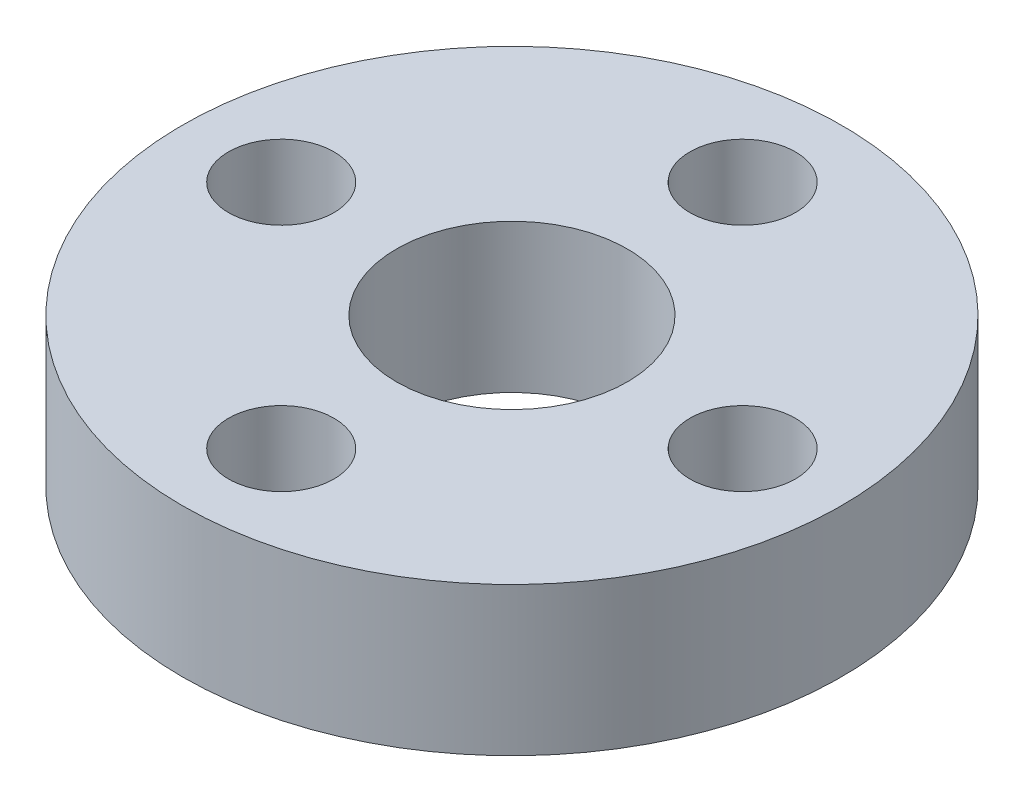
ISO-10303-21;
HEADER;
FILE_DESCRIPTION(('STEP AP214'),'2;1');
FILE_NAME('part.step','',(''),(''),'','','');
FILE_SCHEMA(('AUTOMOTIVE_DESIGN { 1 0 10303 214 1 1 1 1 }'));
ENDSEC;
DATA;
#1=APPLICATION_CONTEXT('core data for automotive mechanical design processes');
#2=APPLICATION_PROTOCOL_DEFINITION('international standard','automotive_design',2000,#1);
#3=PRODUCT_CONTEXT('',#1,'mechanical');
#4=PRODUCT('Part','Part','',(#3));
#5=PRODUCT_RELATED_PRODUCT_CATEGORY('part','',(#4));
#6=PRODUCT_DEFINITION_FORMATION('','',#4);
#7=PRODUCT_DEFINITION_CONTEXT('part definition',#1,'design');
#8=PRODUCT_DEFINITION('design','',#6,#7);
#9=PRODUCT_DEFINITION_SHAPE('','',#8);
#10=(LENGTH_UNIT() NAMED_UNIT(*) SI_UNIT(.MILLI.,.METRE.));
#11=(NAMED_UNIT(*) PLANE_ANGLE_UNIT() SI_UNIT($,.RADIAN.));
#12=(NAMED_UNIT(*) SI_UNIT($,.STERADIAN.) SOLID_ANGLE_UNIT());
#13=UNCERTAINTY_MEASURE_WITH_UNIT(LENGTH_MEASURE(1.E-05),#10,'distance_accuracy_value','');
#14=(GEOMETRIC_REPRESENTATION_CONTEXT(3) GLOBAL_UNCERTAINTY_ASSIGNED_CONTEXT((#13)) GLOBAL_UNIT_ASSIGNED_CONTEXT((#10,
#11,#12)) REPRESENTATION_CONTEXT('',''));
#15=CARTESIAN_POINT('',(0.,0.,0.));
#16=DIRECTION('',(0.,0.,1.));
#17=DIRECTION('',(1.,0.,0.));
#18=AXIS2_PLACEMENT_3D('',#15,#16,#17);
#19=CARTESIAN_POINT('',(0.,4.5,0.));
#20=DIRECTION('',(0.,1.,0.));
#21=DIRECTION('',(0.,0.,1.));
#22=AXIS2_PLACEMENT_3D('',#19,#20,#21);
#23=PLANE('',#22);
#24=CARTESIAN_POINT('',(0.,4.5,7.));
#25=DIRECTION('',(0.,1.,0.));
#26=DIRECTION('',(0.,0.,-1.));
#27=AXIS2_PLACEMENT_3D('',#24,#25,#26);
#28=CIRCLE('',#27,1.6);
#29=CARTESIAN_POINT('',(0.,4.5,5.4));
#30=VERTEX_POINT('',#29);
#31=EDGE_CURVE('E76',#30,#30,#28,.T.);
#32=ORIENTED_EDGE('',*,*,#31,.F.);
#33=EDGE_LOOP('',(#32));
#34=FACE_BOUND('',#33,.T.);
#35=CARTESIAN_POINT('',(7.,4.5,0.));
#36=DIRECTION('',(0.,1.,0.));
#37=DIRECTION('',(0.,0.,1.));
#38=AXIS2_PLACEMENT_3D('',#35,#36,#37);
#39=CIRCLE('',#38,1.6);
#40=CARTESIAN_POINT('',(7.,4.5,1.6));
#41=VERTEX_POINT('',#40);
#42=EDGE_CURVE('E60',#41,#41,#39,.T.);
#43=ORIENTED_EDGE('',*,*,#42,.F.);
#44=EDGE_LOOP('',(#43));
#45=FACE_BOUND('',#44,.T.);
#46=CARTESIAN_POINT('',(0.,4.5,0.));
#47=DIRECTION('',(0.,1.,0.));
#48=DIRECTION('',(0.,0.,1.));
#49=AXIS2_PLACEMENT_3D('',#46,#47,#48);
#50=CIRCLE('',#49,10.);
#51=CARTESIAN_POINT('',(0.,4.5,10.));
#52=VERTEX_POINT('',#51);
#53=EDGE_CURVE('E10',#52,#52,#50,.T.);
#54=ORIENTED_EDGE('',*,*,#53,.T.);
#55=EDGE_LOOP('',(#54));
#56=FACE_BOUND('',#55,.T.);
#57=CARTESIAN_POINT('',(0.,4.5,-7.));
#58=DIRECTION('',(0.,1.,0.));
#59=DIRECTION('',(0.,0.,1.));
#60=AXIS2_PLACEMENT_3D('',#57,#58,#59);
#61=CIRCLE('',#60,1.6);
#62=CARTESIAN_POINT('',(0.,4.5,-5.4));
#63=VERTEX_POINT('',#62);
#64=EDGE_CURVE('E54',#63,#63,#61,.T.);
#65=ORIENTED_EDGE('',*,*,#64,.F.);
#66=EDGE_LOOP('',(#65));
#67=FACE_BOUND('',#66,.T.);
#68=CARTESIAN_POINT('',(0.,4.5,0.));
#69=DIRECTION('',(0.,1.,0.));
#70=DIRECTION('',(0.,0.,1.));
#71=AXIS2_PLACEMENT_3D('',#68,#69,#70);
#72=CIRCLE('',#71,3.5);
#73=CARTESIAN_POINT('',(0.,4.5,3.5));
#74=VERTEX_POINT('',#73);
#75=EDGE_CURVE('E68',#74,#74,#72,.T.);
#76=ORIENTED_EDGE('',*,*,#75,.F.);
#77=EDGE_LOOP('',(#76));
#78=FACE_BOUND('',#77,.T.);
#79=CARTESIAN_POINT('',(-7.,4.5,0.));
#80=DIRECTION('',(0.,1.,0.));
#81=DIRECTION('',(0.,0.,-1.));
#82=AXIS2_PLACEMENT_3D('',#79,#80,#81);
#83=CIRCLE('',#82,1.6);
#84=CARTESIAN_POINT('',(-7.,4.5,-1.6));
#85=VERTEX_POINT('',#84);
#86=EDGE_CURVE('E84',#85,#85,#83,.T.);
#87=ORIENTED_EDGE('',*,*,#86,.F.);
#88=EDGE_LOOP('',(#87));
#89=FACE_BOUND('',#88,.T.);
#90=ADVANCED_FACE('F41',(#34,#45,#56,#67,#78,#89),#23,.T.);
#91=CARTESIAN_POINT('',(0.,0.,0.));
#92=DIRECTION('',(0.,1.,0.));
#93=DIRECTION('',(0.,0.,1.));
#94=AXIS2_PLACEMENT_3D('',#91,#92,#93);
#95=PLANE('',#94);
#96=CARTESIAN_POINT('',(0.,0.,0.));
#97=DIRECTION('',(0.,1.,0.));
#98=DIRECTION('',(0.,0.,1.));
#99=AXIS2_PLACEMENT_3D('',#96,#97,#98);
#100=CIRCLE('',#99,10.);
#101=CARTESIAN_POINT('',(0.,0.,10.));
#102=VERTEX_POINT('',#101);
#103=EDGE_CURVE('E45',#102,#102,#100,.T.);
#104=ORIENTED_EDGE('',*,*,#103,.F.);
#105=EDGE_LOOP('',(#104));
#106=FACE_BOUND('',#105,.T.);
#107=CARTESIAN_POINT('',(0.,0.,-7.));
#108=DIRECTION('',(0.,1.,0.));
#109=DIRECTION('',(0.,0.,1.));
#110=AXIS2_PLACEMENT_3D('',#107,#108,#109);
#111=CIRCLE('',#110,1.6);
#112=CARTESIAN_POINT('',(0.,0.,-5.4));
#113=VERTEX_POINT('',#112);
#114=EDGE_CURVE('E56',#113,#113,#111,.T.);
#115=ORIENTED_EDGE('',*,*,#114,.T.);
#116=EDGE_LOOP('',(#115));
#117=FACE_BOUND('',#116,.T.);
#118=CARTESIAN_POINT('',(7.,0.,0.));
#119=DIRECTION('',(0.,1.,0.));
#120=DIRECTION('',(0.,0.,1.));
#121=AXIS2_PLACEMENT_3D('',#118,#119,#120);
#122=CIRCLE('',#121,1.6);
#123=CARTESIAN_POINT('',(7.,0.,1.6));
#124=VERTEX_POINT('',#123);
#125=EDGE_CURVE('E64',#124,#124,#122,.T.);
#126=ORIENTED_EDGE('',*,*,#125,.T.);
#127=EDGE_LOOP('',(#126));
#128=FACE_BOUND('',#127,.T.);
#129=CARTESIAN_POINT('',(0.,0.,0.));
#130=DIRECTION('',(0.,1.,0.));
#131=DIRECTION('',(0.,0.,1.));
#132=AXIS2_PLACEMENT_3D('',#129,#130,#131);
#133=CIRCLE('',#132,3.5);
#134=CARTESIAN_POINT('',(0.,0.,3.5));
#135=VERTEX_POINT('',#134);
#136=EDGE_CURVE('E72',#135,#135,#133,.T.);
#137=ORIENTED_EDGE('',*,*,#136,.T.);
#138=EDGE_LOOP('',(#137));
#139=FACE_BOUND('',#138,.T.);
#140=CARTESIAN_POINT('',(0.,0.,7.));
#141=DIRECTION('',(0.,1.,0.));
#142=DIRECTION('',(0.,0.,-1.));
#143=AXIS2_PLACEMENT_3D('',#140,#141,#142);
#144=CIRCLE('',#143,1.6);
#145=CARTESIAN_POINT('',(0.,0.,5.4));
#146=VERTEX_POINT('',#145);
#147=EDGE_CURVE('E80',#146,#146,#144,.T.);
#148=ORIENTED_EDGE('',*,*,#147,.T.);
#149=EDGE_LOOP('',(#148));
#150=FACE_BOUND('',#149,.T.);
#151=CARTESIAN_POINT('',(-7.,0.,0.));
#152=DIRECTION('',(0.,1.,0.));
#153=DIRECTION('',(0.,0.,-1.));
#154=AXIS2_PLACEMENT_3D('',#151,#152,#153);
#155=CIRCLE('',#154,1.6);
#156=CARTESIAN_POINT('',(-7.,0.,-1.6));
#157=VERTEX_POINT('',#156);
#158=EDGE_CURVE('E88',#157,#157,#155,.T.);
#159=ORIENTED_EDGE('',*,*,#158,.T.);
#160=EDGE_LOOP('',(#159));
#161=FACE_BOUND('',#160,.T.);
#162=ADVANCED_FACE('F100',(#106,#117,#128,#139,#150,#161),#95,.F.);
#163=CARTESIAN_POINT('',(0.,4.5,0.));
#164=DIRECTION('',(0.,-1.,0.));
#165=DIRECTION('',(0.,0.,-1.));
#166=AXIS2_PLACEMENT_3D('',#163,#164,#165);
#167=CYLINDRICAL_SURFACE('',#166,10.);
#168=ORIENTED_EDGE('',*,*,#53,.F.);
#169=EDGE_LOOP('',(#168));
#170=FACE_BOUND('',#169,.T.);
#171=ORIENTED_EDGE('',*,*,#103,.T.);
#172=EDGE_LOOP('',(#171));
#173=FACE_BOUND('',#172,.T.);
#174=ADVANCED_FACE('F43',(#170,#173),#167,.T.);
#175=CARTESIAN_POINT('',(0.,4.5,-7.));
#176=DIRECTION('',(0.,-1.,0.));
#177=DIRECTION('',(0.,0.,-1.));
#178=AXIS2_PLACEMENT_3D('',#175,#176,#177);
#179=CYLINDRICAL_SURFACE('',#178,1.6);
#180=ORIENTED_EDGE('',*,*,#64,.T.);
#181=EDGE_LOOP('',(#180));
#182=FACE_BOUND('',#181,.T.);
#183=ORIENTED_EDGE('',*,*,#114,.F.);
#184=EDGE_LOOP('',(#183));
#185=FACE_BOUND('',#184,.T.);
#186=ADVANCED_FACE('F110',(#182,#185),#179,.F.);
#187=CARTESIAN_POINT('',(7.,4.5,0.));
#188=DIRECTION('',(0.,-1.,0.));
#189=DIRECTION('',(0.,0.,-1.));
#190=AXIS2_PLACEMENT_3D('',#187,#188,#189);
#191=CYLINDRICAL_SURFACE('',#190,1.6);
#192=ORIENTED_EDGE('',*,*,#42,.T.);
#193=EDGE_LOOP('',(#192));
#194=FACE_BOUND('',#193,.T.);
#195=ORIENTED_EDGE('',*,*,#125,.F.);
#196=EDGE_LOOP('',(#195));
#197=FACE_BOUND('',#196,.T.);
#198=ADVANCED_FACE('F113',(#194,#197),#191,.F.);
#199=CARTESIAN_POINT('',(0.,4.5,0.));
#200=DIRECTION('',(0.,-1.,0.));
#201=DIRECTION('',(0.,0.,-1.));
#202=AXIS2_PLACEMENT_3D('',#199,#200,#201);
#203=CYLINDRICAL_SURFACE('',#202,3.5);
#204=ORIENTED_EDGE('',*,*,#75,.T.);
#205=EDGE_LOOP('',(#204));
#206=FACE_BOUND('',#205,.T.);
#207=ORIENTED_EDGE('',*,*,#136,.F.);
#208=EDGE_LOOP('',(#207));
#209=FACE_BOUND('',#208,.T.);
#210=ADVANCED_FACE('F117',(#206,#209),#203,.F.);
#211=CARTESIAN_POINT('',(0.,4.5,7.));
#212=DIRECTION('',(0.,-1.,0.));
#213=DIRECTION('',(0.,0.,-1.));
#214=AXIS2_PLACEMENT_3D('',#211,#212,#213);
#215=CYLINDRICAL_SURFACE('',#214,1.6);
#216=ORIENTED_EDGE('',*,*,#31,.T.);
#217=EDGE_LOOP('',(#216));
#218=FACE_BOUND('',#217,.T.);
#219=ORIENTED_EDGE('',*,*,#147,.F.);
#220=EDGE_LOOP('',(#219));
#221=FACE_BOUND('',#220,.T.);
#222=ADVANCED_FACE('F121',(#218,#221),#215,.F.);
#223=CARTESIAN_POINT('',(-7.,4.5,0.));
#224=DIRECTION('',(0.,-1.,0.));
#225=DIRECTION('',(0.,0.,-1.));
#226=AXIS2_PLACEMENT_3D('',#223,#224,#225);
#227=CYLINDRICAL_SURFACE('',#226,1.6);
#228=ORIENTED_EDGE('',*,*,#86,.T.);
#229=EDGE_LOOP('',(#228));
#230=FACE_BOUND('',#229,.T.);
#231=ORIENTED_EDGE('',*,*,#158,.F.);
#232=EDGE_LOOP('',(#231));
#233=FACE_BOUND('',#232,.T.);
#234=ADVANCED_FACE('F96',(#230,#233),#227,.F.);
#235=CLOSED_SHELL('',(#90,#162,#174,#186,#198,#210,#222,#234));
#236=MANIFOLD_SOLID_BREP('B2',#235);
#237=ADVANCED_BREP_SHAPE_REPRESENTATION('',(#18,#236),#14);
#238=SHAPE_DEFINITION_REPRESENTATION(#9,#237);
ENDSEC;
END-ISO-10303-21;
